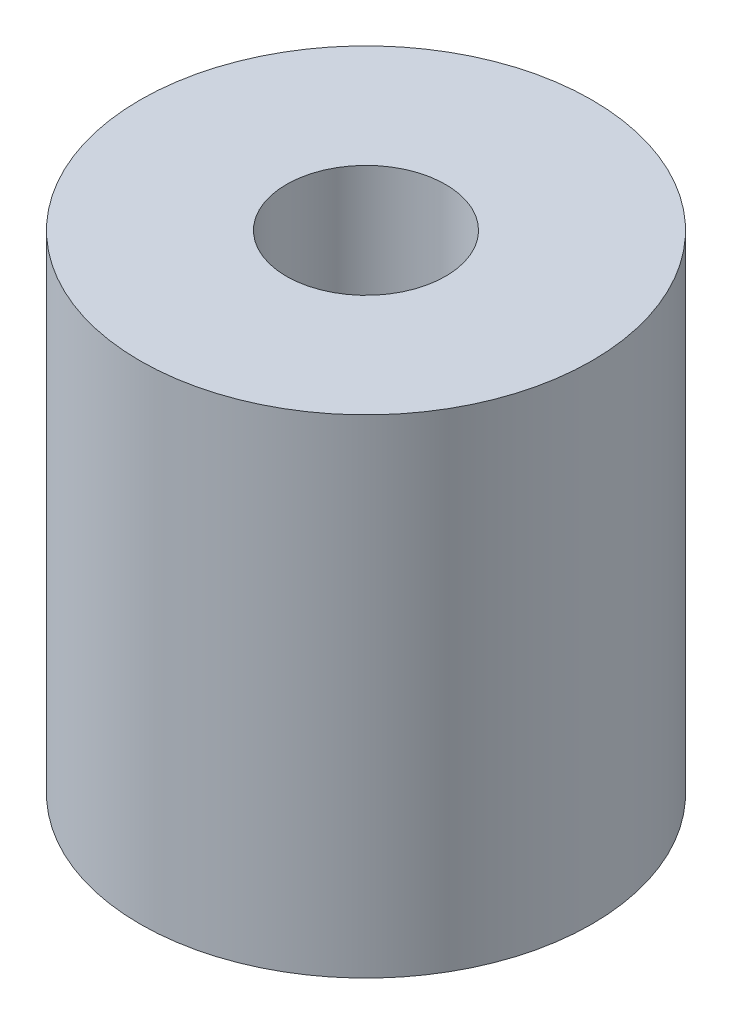
ISO-10303-21;
HEADER;
FILE_DESCRIPTION(('STEP AP214'),'2;1');
FILE_NAME('part.step','',(''),(''),'','','');
FILE_SCHEMA(('AUTOMOTIVE_DESIGN { 1 0 10303 214 1 1 1 1 }'));
ENDSEC;
DATA;
#1=APPLICATION_CONTEXT('core data for automotive mechanical design processes');
#2=APPLICATION_PROTOCOL_DEFINITION('international standard','automotive_design',2000,#1);
#3=PRODUCT_CONTEXT('',#1,'mechanical');
#4=PRODUCT('Part','Part','',(#3));
#5=PRODUCT_RELATED_PRODUCT_CATEGORY('part','',(#4));
#6=PRODUCT_DEFINITION_FORMATION('','',#4);
#7=PRODUCT_DEFINITION_CONTEXT('part definition',#1,'design');
#8=PRODUCT_DEFINITION('design','',#6,#7);
#9=PRODUCT_DEFINITION_SHAPE('','',#8);
#10=(LENGTH_UNIT() NAMED_UNIT(*) SI_UNIT(.MILLI.,.METRE.));
#11=(NAMED_UNIT(*) PLANE_ANGLE_UNIT() SI_UNIT($,.RADIAN.));
#12=(NAMED_UNIT(*) SI_UNIT($,.STERADIAN.) SOLID_ANGLE_UNIT());
#13=UNCERTAINTY_MEASURE_WITH_UNIT(LENGTH_MEASURE(1.E-05),#10,'distance_accuracy_value','');
#14=(GEOMETRIC_REPRESENTATION_CONTEXT(3) GLOBAL_UNCERTAINTY_ASSIGNED_CONTEXT((#13)) GLOBAL_UNIT_ASSIGNED_CONTEXT((#10,
#11,#12)) REPRESENTATION_CONTEXT('',''));
#15=CARTESIAN_POINT('',(0.,0.,0.));
#16=DIRECTION('',(0.,0.,1.));
#17=DIRECTION('',(1.,0.,0.));
#18=AXIS2_PLACEMENT_3D('',#15,#16,#17);
#19=CARTESIAN_POINT('',(0.,10.,0.));
#20=DIRECTION('',(0.,1.,0.));
#21=DIRECTION('',(0.,0.,1.));
#22=AXIS2_PLACEMENT_3D('',#19,#20,#21);
#23=PLANE('',#22);
#24=CARTESIAN_POINT('',(0.,10.,0.));
#25=DIRECTION('',(0.,1.,0.));
#26=DIRECTION('',(0.,0.,1.));
#27=AXIS2_PLACEMENT_3D('',#24,#25,#26);
#28=CIRCLE('',#27,4.63195);
#29=CARTESIAN_POINT('',(0.,10.,4.63195));
#30=VERTEX_POINT('',#29);
#31=EDGE_CURVE('E10',#30,#30,#28,.T.);
#32=ORIENTED_EDGE('',*,*,#31,.T.);
#33=EDGE_LOOP('',(#32));
#34=FACE_BOUND('',#33,.T.);
#35=CARTESIAN_POINT('',(0.,10.,0.));
#36=DIRECTION('',(0.,1.,0.));
#37=DIRECTION('',(0.,0.,1.));
#38=AXIS2_PLACEMENT_3D('',#35,#36,#37);
#39=CIRCLE('',#38,1.63195);
#40=CARTESIAN_POINT('',(0.,10.,1.63195));
#41=VERTEX_POINT('',#40);
#42=EDGE_CURVE('E54',#41,#41,#39,.T.);
#43=ORIENTED_EDGE('',*,*,#42,.F.);
#44=EDGE_LOOP('',(#43));
#45=FACE_BOUND('',#44,.T.);
#46=ADVANCED_FACE('F41',(#34,#45),#23,.T.);
#47=CARTESIAN_POINT('',(0.,0.,0.));
#48=DIRECTION('',(0.,1.,0.));
#49=DIRECTION('',(0.,0.,1.));
#50=AXIS2_PLACEMENT_3D('',#47,#48,#49);
#51=PLANE('',#50);
#52=CARTESIAN_POINT('',(0.,0.,0.));
#53=DIRECTION('',(0.,1.,0.));
#54=DIRECTION('',(0.,0.,1.));
#55=AXIS2_PLACEMENT_3D('',#52,#53,#54);
#56=CIRCLE('',#55,4.63195);
#57=CARTESIAN_POINT('',(0.,0.,4.63195));
#58=VERTEX_POINT('',#57);
#59=EDGE_CURVE('E45',#58,#58,#56,.T.);
#60=ORIENTED_EDGE('',*,*,#59,.F.);
#61=EDGE_LOOP('',(#60));
#62=FACE_BOUND('',#61,.T.);
#63=CARTESIAN_POINT('',(0.,0.,0.));
#64=DIRECTION('',(0.,1.,0.));
#65=DIRECTION('',(0.,0.,1.));
#66=AXIS2_PLACEMENT_3D('',#63,#64,#65);
#67=CIRCLE('',#66,1.63195);
#68=CARTESIAN_POINT('',(0.,0.,1.63195));
#69=VERTEX_POINT('',#68);
#70=EDGE_CURVE('E56',#69,#69,#67,.T.);
#71=ORIENTED_EDGE('',*,*,#70,.T.);
#72=EDGE_LOOP('',(#71));
#73=FACE_BOUND('',#72,.T.);
#74=ADVANCED_FACE('F68',(#62,#73),#51,.F.);
#75=CARTESIAN_POINT('',(0.,10.,0.));
#76=DIRECTION('',(0.,-1.,0.));
#77=DIRECTION('',(0.,0.,-1.));
#78=AXIS2_PLACEMENT_3D('',#75,#76,#77);
#79=CYLINDRICAL_SURFACE('',#78,4.63195);
#80=ORIENTED_EDGE('',*,*,#31,.F.);
#81=EDGE_LOOP('',(#80));
#82=FACE_BOUND('',#81,.T.);
#83=ORIENTED_EDGE('',*,*,#59,.T.);
#84=EDGE_LOOP('',(#83));
#85=FACE_BOUND('',#84,.T.);
#86=ADVANCED_FACE('F43',(#82,#85),#79,.T.);
#87=CARTESIAN_POINT('',(0.,10.,0.));
#88=DIRECTION('',(0.,-1.,0.));
#89=DIRECTION('',(0.,0.,-1.));
#90=AXIS2_PLACEMENT_3D('',#87,#88,#89);
#91=CYLINDRICAL_SURFACE('',#90,1.63195);
#92=ORIENTED_EDGE('',*,*,#42,.T.);
#93=EDGE_LOOP('',(#92));
#94=FACE_BOUND('',#93,.T.);
#95=ORIENTED_EDGE('',*,*,#70,.F.);
#96=EDGE_LOOP('',(#95));
#97=FACE_BOUND('',#96,.T.);
#98=ADVANCED_FACE('F64',(#94,#97),#91,.F.);
#99=CLOSED_SHELL('',(#46,#74,#86,#98));
#100=MANIFOLD_SOLID_BREP('B2',#99);
#101=ADVANCED_BREP_SHAPE_REPRESENTATION('',(#18,#100),#14);
#102=SHAPE_DEFINITION_REPRESENTATION(#9,#101);
ENDSEC;
END-ISO-10303-21;
